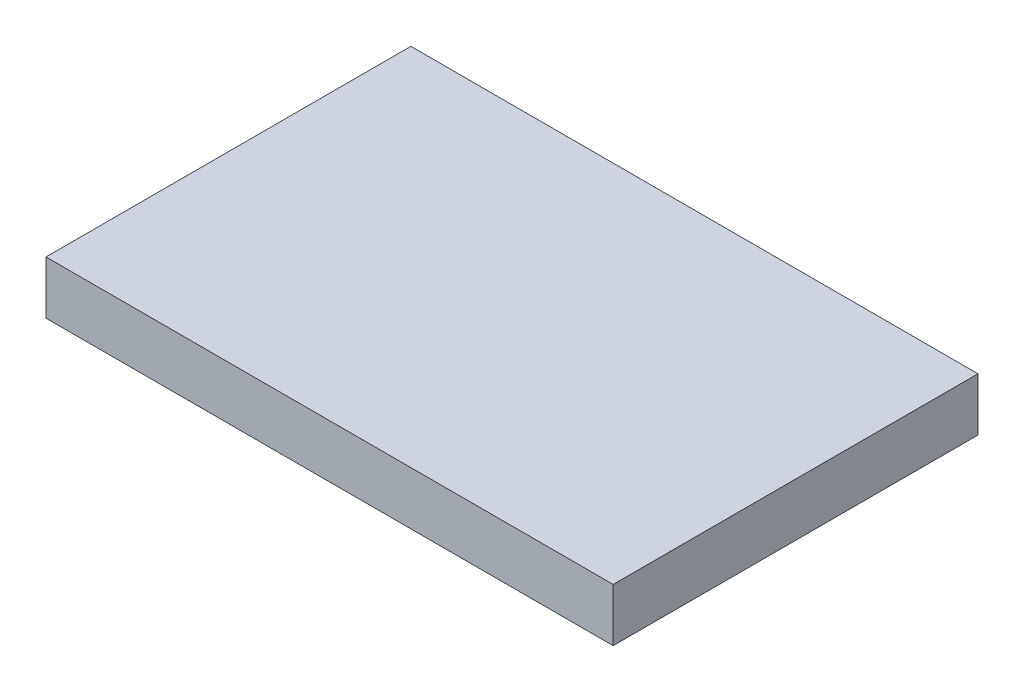
ISO-10303-21;
HEADER;
FILE_DESCRIPTION(('STEP AP214'),'2;1');
FILE_NAME('part.step','',(''),(''),'','','');
FILE_SCHEMA(('AUTOMOTIVE_DESIGN { 1 0 10303 214 1 1 1 1 }'));
ENDSEC;
DATA;
#1=APPLICATION_CONTEXT('core data for automotive mechanical design processes');
#2=APPLICATION_PROTOCOL_DEFINITION('international standard','automotive_design',2000,#1);
#3=PRODUCT_CONTEXT('',#1,'mechanical');
#4=PRODUCT('Part','Part','',(#3));
#5=PRODUCT_RELATED_PRODUCT_CATEGORY('part','',(#4));
#6=PRODUCT_DEFINITION_FORMATION('','',#4);
#7=PRODUCT_DEFINITION_CONTEXT('part definition',#1,'design');
#8=PRODUCT_DEFINITION('design','',#6,#7);
#9=PRODUCT_DEFINITION_SHAPE('','',#8);
#10=(LENGTH_UNIT() NAMED_UNIT(*) SI_UNIT(.MILLI.,.METRE.));
#11=(NAMED_UNIT(*) PLANE_ANGLE_UNIT() SI_UNIT($,.RADIAN.));
#12=(NAMED_UNIT(*) SI_UNIT($,.STERADIAN.) SOLID_ANGLE_UNIT());
#13=UNCERTAINTY_MEASURE_WITH_UNIT(LENGTH_MEASURE(1.E-05),#10,'distance_accuracy_value','');
#14=(GEOMETRIC_REPRESENTATION_CONTEXT(3) GLOBAL_UNCERTAINTY_ASSIGNED_CONTEXT((#13)) GLOBAL_UNIT_ASSIGNED_CONTEXT((#10,
#11,#12)) REPRESENTATION_CONTEXT('',''));
#15=CARTESIAN_POINT('',(0.,0.,0.));
#16=DIRECTION('',(0.,0.,1.));
#17=DIRECTION('',(1.,0.,0.));
#18=AXIS2_PLACEMENT_3D('',#15,#16,#17);
#19=CARTESIAN_POINT('',(0.,2.,0.));
#20=DIRECTION('',(0.,1.,0.));
#21=DIRECTION('',(0.,0.,1.));
#22=AXIS2_PLACEMENT_3D('',#19,#20,#21);
#23=PLANE('',#22);
#24=DIRECTION('',(-1.,0.,0.));
#25=VECTOR('',#24,1.);
#26=CARTESIAN_POINT('',(-2.,2.,-2.));
#27=LINE('',#26,#25);
#28=CARTESIAN_POINT('',(83.5,2.,-2.));
#29=VERTEX_POINT('',#28);
#30=CARTESIAN_POINT('',(-2.,2.,-2.));
#31=VERTEX_POINT('',#30);
#32=EDGE_CURVE('E124',#29,#31,#27,.T.);
#33=ORIENTED_EDGE('',*,*,#32,.T.);
#34=DIRECTION('',(0.,0.,1.));
#35=VECTOR('',#34,1.);
#36=CARTESIAN_POINT('',(-2.,2.,-2.));
#37=LINE('',#36,#35);
#38=CARTESIAN_POINT('',(-2.,2.,53.));
#39=VERTEX_POINT('',#38);
#40=EDGE_CURVE('E145',#31,#39,#37,.T.);
#41=ORIENTED_EDGE('',*,*,#40,.T.);
#42=DIRECTION('',(1.,0.,0.));
#43=VECTOR('',#42,1.);
#44=CARTESIAN_POINT('',(-2.,2.,53.));
#45=LINE('',#44,#43);
#46=CARTESIAN_POINT('',(83.5,2.,53.));
#47=VERTEX_POINT('',#46);
#48=EDGE_CURVE('E148',#39,#47,#45,.T.);
#49=ORIENTED_EDGE('',*,*,#48,.T.);
#50=DIRECTION('',(0.,0.,-1.));
#51=VECTOR('',#50,1.);
#52=CARTESIAN_POINT('',(83.5,2.,-2.));
#53=LINE('',#52,#51);
#54=EDGE_CURVE('E133',#47,#29,#53,.T.);
#55=ORIENTED_EDGE('',*,*,#54,.T.);
#56=EDGE_LOOP('',(#33,#41,#49,#55));
#57=FACE_BOUND('',#56,.T.);
#58=ADVANCED_FACE('F33',(#57),#23,.T.);
#59=CARTESIAN_POINT('',(0.,-6.,0.));
#60=DIRECTION('',(-1.,0.,0.));
#61=DIRECTION('',(0.,0.,1.));
#62=AXIS2_PLACEMENT_3D('',#59,#60,#61);
#63=PLANE('',#62);
#64=DIRECTION('',(0.,1.,0.));
#65=VECTOR('',#64,1.);
#66=CARTESIAN_POINT('',(0.,-6.,0.));
#67=LINE('',#66,#65);
#68=CARTESIAN_POINT('',(0.,-6.,0.));
#69=VERTEX_POINT('',#68);
#70=CARTESIAN_POINT('',(0.,0.,0.));
#71=VERTEX_POINT('',#70);
#72=EDGE_CURVE('E122',#69,#71,#67,.T.);
#73=ORIENTED_EDGE('',*,*,#72,.T.);
#74=DIRECTION('',(0.,0.,1.));
#75=VECTOR('',#74,1.);
#76=CARTESIAN_POINT('',(0.,0.,0.));
#77=LINE('',#76,#75);
#78=CARTESIAN_POINT('',(0.,0.,51.));
#79=VERTEX_POINT('',#78);
#80=EDGE_CURVE('E48',#71,#79,#77,.T.);
#81=ORIENTED_EDGE('',*,*,#80,.T.);
#82=DIRECTION('',(0.,1.,0.));
#83=VECTOR('',#82,1.);
#84=CARTESIAN_POINT('',(0.,-6.,51.));
#85=LINE('',#84,#83);
#86=CARTESIAN_POINT('',(0.,-6.,51.));
#87=VERTEX_POINT('',#86);
#88=EDGE_CURVE('E94',#87,#79,#85,.T.);
#89=ORIENTED_EDGE('',*,*,#88,.F.);
#90=DIRECTION('',(0.,0.,1.));
#91=VECTOR('',#90,1.);
#92=CARTESIAN_POINT('',(0.,-6.,0.));
#93=LINE('',#92,#91);
#94=EDGE_CURVE('E99',#69,#87,#93,.T.);
#95=ORIENTED_EDGE('',*,*,#94,.F.);
#96=EDGE_LOOP('',(#73,#81,#89,#95));
#97=FACE_BOUND('',#96,.T.);
#98=ADVANCED_FACE('F97',(#97),#63,.F.);
#99=CARTESIAN_POINT('',(0.,-6.,0.));
#100=DIRECTION('',(0.,0.,-1.));
#101=DIRECTION('',(-1.,0.,0.));
#102=AXIS2_PLACEMENT_3D('',#99,#100,#101);
#103=PLANE('',#102);
#104=DIRECTION('',(0.,1.,0.));
#105=VECTOR('',#104,1.);
#106=CARTESIAN_POINT('',(81.5,-6.,0.));
#107=LINE('',#106,#105);
#108=CARTESIAN_POINT('',(81.5,-6.,0.));
#109=VERTEX_POINT('',#108);
#110=CARTESIAN_POINT('',(81.5,0.,0.));
#111=VERTEX_POINT('',#110);
#112=EDGE_CURVE('E125',#109,#111,#107,.T.);
#113=ORIENTED_EDGE('',*,*,#112,.T.);
#114=DIRECTION('',(-1.,0.,0.));
#115=VECTOR('',#114,1.);
#116=CARTESIAN_POINT('',(0.,0.,0.));
#117=LINE('',#116,#115);
#118=EDGE_CURVE('E11',#111,#71,#117,.T.);
#119=ORIENTED_EDGE('',*,*,#118,.T.);
#120=ORIENTED_EDGE('',*,*,#72,.F.);
#121=DIRECTION('',(-1.,0.,0.));
#122=VECTOR('',#121,1.);
#123=CARTESIAN_POINT('',(0.,-6.,0.));
#124=LINE('',#123,#122);
#125=EDGE_CURVE('E104',#109,#69,#124,.T.);
#126=ORIENTED_EDGE('',*,*,#125,.F.);
#127=EDGE_LOOP('',(#113,#119,#120,#126));
#128=FACE_BOUND('',#127,.T.);
#129=ADVANCED_FACE('F165',(#128),#103,.F.);
#130=CARTESIAN_POINT('',(81.5,-6.,0.));
#131=DIRECTION('',(1.,0.,0.));
#132=DIRECTION('',(0.,0.,-1.));
#133=AXIS2_PLACEMENT_3D('',#130,#131,#132);
#134=PLANE('',#133);
#135=DIRECTION('',(0.,1.,0.));
#136=VECTOR('',#135,1.);
#137=CARTESIAN_POINT('',(81.5,-6.,51.));
#138=LINE('',#137,#136);
#139=CARTESIAN_POINT('',(81.5,-6.,51.));
#140=VERTEX_POINT('',#139);
#141=CARTESIAN_POINT('',(81.5,0.,51.));
#142=VERTEX_POINT('',#141);
#143=EDGE_CURVE('E103',#140,#142,#138,.T.);
#144=ORIENTED_EDGE('',*,*,#143,.T.);
#145=DIRECTION('',(0.,0.,-1.));
#146=VECTOR('',#145,1.);
#147=CARTESIAN_POINT('',(81.5,0.,0.));
#148=LINE('',#147,#146);
#149=EDGE_CURVE('E41',#142,#111,#148,.T.);
#150=ORIENTED_EDGE('',*,*,#149,.T.);
#151=ORIENTED_EDGE('',*,*,#112,.F.);
#152=DIRECTION('',(0.,0.,-1.));
#153=VECTOR('',#152,1.);
#154=CARTESIAN_POINT('',(81.5,-6.,0.));
#155=LINE('',#154,#153);
#156=EDGE_CURVE('E113',#140,#109,#155,.T.);
#157=ORIENTED_EDGE('',*,*,#156,.F.);
#158=EDGE_LOOP('',(#144,#150,#151,#157));
#159=FACE_BOUND('',#158,.T.);
#160=ADVANCED_FACE('F163',(#159),#134,.F.);
#161=CARTESIAN_POINT('',(0.,-6.,51.));
#162=DIRECTION('',(0.,0.,1.));
#163=DIRECTION('',(1.,0.,0.));
#164=AXIS2_PLACEMENT_3D('',#161,#162,#163);
#165=PLANE('',#164);
#166=ORIENTED_EDGE('',*,*,#88,.T.);
#167=DIRECTION('',(1.,0.,0.));
#168=VECTOR('',#167,1.);
#169=CARTESIAN_POINT('',(0.,0.,51.));
#170=LINE('',#169,#168);
#171=EDGE_CURVE('E161',#79,#142,#170,.T.);
#172=ORIENTED_EDGE('',*,*,#171,.T.);
#173=ORIENTED_EDGE('',*,*,#143,.F.);
#174=DIRECTION('',(1.,0.,0.));
#175=VECTOR('',#174,1.);
#176=CARTESIAN_POINT('',(0.,-6.,51.));
#177=LINE('',#176,#175);
#178=EDGE_CURVE('E108',#87,#140,#177,.T.);
#179=ORIENTED_EDGE('',*,*,#178,.F.);
#180=EDGE_LOOP('',(#166,#172,#173,#179));
#181=FACE_BOUND('',#180,.T.);
#182=ADVANCED_FACE('F109',(#181),#165,.F.);
#183=CARTESIAN_POINT('',(-2.,-6.,-2.));
#184=DIRECTION('',(0.,0.,-1.));
#185=DIRECTION('',(-1.,0.,0.));
#186=AXIS2_PLACEMENT_3D('',#183,#184,#185);
#187=PLANE('',#186);
#188=ORIENTED_EDGE('',*,*,#32,.F.);
#189=DIRECTION('',(0.,1.,0.));
#190=VECTOR('',#189,1.);
#191=CARTESIAN_POINT('',(83.5,-6.,-2.));
#192=LINE('',#191,#190);
#193=CARTESIAN_POINT('',(83.5,-6.,-2.));
#194=VERTEX_POINT('',#193);
#195=EDGE_CURVE('E153',#194,#29,#192,.T.);
#196=ORIENTED_EDGE('',*,*,#195,.F.);
#197=DIRECTION('',(-1.,0.,0.));
#198=VECTOR('',#197,1.);
#199=CARTESIAN_POINT('',(-2.,-6.,-2.));
#200=LINE('',#199,#198);
#201=CARTESIAN_POINT('',(-2.,-6.,-2.));
#202=VERTEX_POINT('',#201);
#203=EDGE_CURVE('E129',#194,#202,#200,.T.);
#204=ORIENTED_EDGE('',*,*,#203,.T.);
#205=DIRECTION('',(0.,1.,0.));
#206=VECTOR('',#205,1.);
#207=CARTESIAN_POINT('',(-2.,-6.,-2.));
#208=LINE('',#207,#206);
#209=EDGE_CURVE('E142',#202,#31,#208,.T.);
#210=ORIENTED_EDGE('',*,*,#209,.T.);
#211=EDGE_LOOP('',(#188,#196,#204,#210));
#212=FACE_BOUND('',#211,.T.);
#213=ADVANCED_FACE('F179',(#212),#187,.T.);
#214=CARTESIAN_POINT('',(83.5,-6.,-2.));
#215=DIRECTION('',(1.,0.,0.));
#216=DIRECTION('',(0.,0.,-1.));
#217=AXIS2_PLACEMENT_3D('',#214,#215,#216);
#218=PLANE('',#217);
#219=ORIENTED_EDGE('',*,*,#54,.F.);
#220=DIRECTION('',(0.,1.,0.));
#221=VECTOR('',#220,1.);
#222=CARTESIAN_POINT('',(83.5,-6.,53.));
#223=LINE('',#222,#221);
#224=CARTESIAN_POINT('',(83.5,-6.,53.));
#225=VERTEX_POINT('',#224);
#226=EDGE_CURVE('E155',#225,#47,#223,.T.);
#227=ORIENTED_EDGE('',*,*,#226,.F.);
#228=DIRECTION('',(0.,0.,-1.));
#229=VECTOR('',#228,1.);
#230=CARTESIAN_POINT('',(83.5,-6.,-2.));
#231=LINE('',#230,#229);
#232=EDGE_CURVE('E139',#225,#194,#231,.T.);
#233=ORIENTED_EDGE('',*,*,#232,.T.);
#234=ORIENTED_EDGE('',*,*,#195,.T.);
#235=EDGE_LOOP('',(#219,#227,#233,#234));
#236=FACE_BOUND('',#235,.T.);
#237=ADVANCED_FACE('F182',(#236),#218,.T.);
#238=CARTESIAN_POINT('',(-2.,-6.,53.));
#239=DIRECTION('',(0.,0.,1.));
#240=DIRECTION('',(1.,0.,0.));
#241=AXIS2_PLACEMENT_3D('',#238,#239,#240);
#242=PLANE('',#241);
#243=ORIENTED_EDGE('',*,*,#48,.F.);
#244=DIRECTION('',(0.,1.,0.));
#245=VECTOR('',#244,1.);
#246=CARTESIAN_POINT('',(-2.,-6.,53.));
#247=LINE('',#246,#245);
#248=CARTESIAN_POINT('',(-2.,-6.,53.));
#249=VERTEX_POINT('',#248);
#250=EDGE_CURVE('E157',#249,#39,#247,.T.);
#251=ORIENTED_EDGE('',*,*,#250,.F.);
#252=DIRECTION('',(1.,0.,0.));
#253=VECTOR('',#252,1.);
#254=CARTESIAN_POINT('',(-2.,-6.,53.));
#255=LINE('',#254,#253);
#256=EDGE_CURVE('E136',#249,#225,#255,.T.);
#257=ORIENTED_EDGE('',*,*,#256,.T.);
#258=ORIENTED_EDGE('',*,*,#226,.T.);
#259=EDGE_LOOP('',(#243,#251,#257,#258));
#260=FACE_BOUND('',#259,.T.);
#261=ADVANCED_FACE('F187',(#260),#242,.T.);
#262=CARTESIAN_POINT('',(-2.,-6.,-2.));
#263=DIRECTION('',(-1.,0.,0.));
#264=DIRECTION('',(0.,0.,1.));
#265=AXIS2_PLACEMENT_3D('',#262,#263,#264);
#266=PLANE('',#265);
#267=ORIENTED_EDGE('',*,*,#40,.F.);
#268=ORIENTED_EDGE('',*,*,#209,.F.);
#269=DIRECTION('',(0.,0.,1.));
#270=VECTOR('',#269,1.);
#271=CARTESIAN_POINT('',(-2.,-6.,-2.));
#272=LINE('',#271,#270);
#273=EDGE_CURVE('E132',#202,#249,#272,.T.);
#274=ORIENTED_EDGE('',*,*,#273,.T.);
#275=ORIENTED_EDGE('',*,*,#250,.T.);
#276=EDGE_LOOP('',(#267,#268,#274,#275));
#277=FACE_BOUND('',#276,.T.);
#278=ADVANCED_FACE('F184',(#277),#266,.T.);
#279=CARTESIAN_POINT('',(0.,-6.,0.));
#280=DIRECTION('',(0.,-1.,0.));
#281=DIRECTION('',(0.,0.,-1.));
#282=AXIS2_PLACEMENT_3D('',#279,#280,#281);
#283=PLANE('',#282);
#284=ORIENTED_EDGE('',*,*,#94,.T.);
#285=ORIENTED_EDGE('',*,*,#178,.T.);
#286=ORIENTED_EDGE('',*,*,#156,.T.);
#287=ORIENTED_EDGE('',*,*,#125,.T.);
#288=EDGE_LOOP('',(#284,#285,#286,#287));
#289=FACE_BOUND('',#288,.T.);
#290=ORIENTED_EDGE('',*,*,#203,.F.);
#291=ORIENTED_EDGE('',*,*,#232,.F.);
#292=ORIENTED_EDGE('',*,*,#256,.F.);
#293=ORIENTED_EDGE('',*,*,#273,.F.);
#294=EDGE_LOOP('',(#290,#291,#292,#293));
#295=FACE_BOUND('',#294,.T.);
#296=ADVANCED_FACE('F115',(#289,#295),#283,.T.);
#297=CARTESIAN_POINT('',(0.,0.,0.));
#298=DIRECTION('',(0.,1.,0.));
#299=DIRECTION('',(0.,0.,1.));
#300=AXIS2_PLACEMENT_3D('',#297,#298,#299);
#301=PLANE('',#300);
#302=ORIENTED_EDGE('',*,*,#80,.F.);
#303=ORIENTED_EDGE('',*,*,#118,.F.);
#304=ORIENTED_EDGE('',*,*,#149,.F.);
#305=ORIENTED_EDGE('',*,*,#171,.F.);
#306=EDGE_LOOP('',(#302,#303,#304,#305));
#307=FACE_BOUND('',#306,.T.);
#308=ADVANCED_FACE('F35',(#307),#301,.F.);
#309=CLOSED_SHELL('',(#58,#98,#129,#160,#182,#213,#237,#261,#278,#296,#308));
#310=MANIFOLD_SOLID_BREP('B2',#309);
#311=ADVANCED_BREP_SHAPE_REPRESENTATION('',(#18,#310),#14);
#312=SHAPE_DEFINITION_REPRESENTATION(#9,#311);
ENDSEC;
END-ISO-10303-21;
